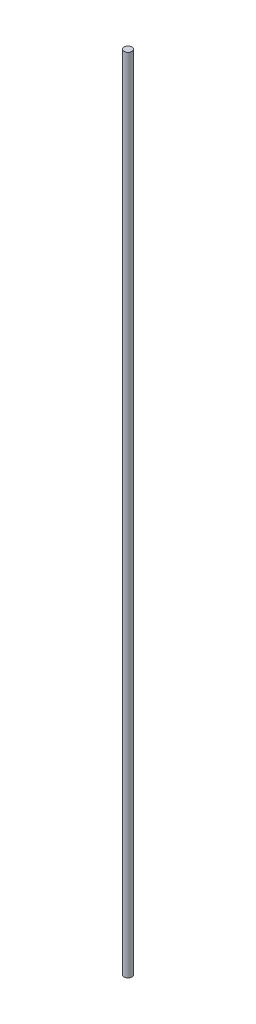
ISO-10303-21;
HEADER;
FILE_DESCRIPTION(('STEP AP214'),'2;1');
FILE_NAME('part.step','',(''),(''),'','','');
FILE_SCHEMA(('AUTOMOTIVE_DESIGN { 1 0 10303 214 1 1 1 1 }'));
ENDSEC;
DATA;
#1=APPLICATION_CONTEXT('core data for automotive mechanical design processes');
#2=APPLICATION_PROTOCOL_DEFINITION('international standard','automotive_design',2000,#1);
#3=PRODUCT_CONTEXT('',#1,'mechanical');
#4=PRODUCT('Part','Part','',(#3));
#5=PRODUCT_RELATED_PRODUCT_CATEGORY('part','',(#4));
#6=PRODUCT_DEFINITION_FORMATION('','',#4);
#7=PRODUCT_DEFINITION_CONTEXT('part definition',#1,'design');
#8=PRODUCT_DEFINITION('design','',#6,#7);
#9=PRODUCT_DEFINITION_SHAPE('','',#8);
#10=(LENGTH_UNIT() NAMED_UNIT(*) SI_UNIT(.MILLI.,.METRE.));
#11=(NAMED_UNIT(*) PLANE_ANGLE_UNIT() SI_UNIT($,.RADIAN.));
#12=(NAMED_UNIT(*) SI_UNIT($,.STERADIAN.) SOLID_ANGLE_UNIT());
#13=UNCERTAINTY_MEASURE_WITH_UNIT(LENGTH_MEASURE(1.E-05),#10,'distance_accuracy_value','');
#14=(GEOMETRIC_REPRESENTATION_CONTEXT(3) GLOBAL_UNCERTAINTY_ASSIGNED_CONTEXT((#13)) GLOBAL_UNIT_ASSIGNED_CONTEXT((#10,
#11,#12)) REPRESENTATION_CONTEXT('',''));
#15=CARTESIAN_POINT('',(0.,0.,0.));
#16=DIRECTION('',(0.,0.,1.));
#17=DIRECTION('',(1.,0.,0.));
#18=AXIS2_PLACEMENT_3D('',#15,#16,#17);
#19=CARTESIAN_POINT('',(0.,822.96,0.));
#20=DIRECTION('',(0.,-1.,0.));
#21=DIRECTION('',(0.,0.,-1.));
#22=AXIS2_PLACEMENT_3D('',#19,#20,#21);
#23=CYLINDRICAL_SURFACE('',#22,4.);
#24=CARTESIAN_POINT('',(0.,822.96,0.));
#25=DIRECTION('',(0.,1.,0.));
#26=DIRECTION('',(0.,0.,1.));
#27=AXIS2_PLACEMENT_3D('',#24,#25,#26);
#28=CIRCLE('',#27,4.);
#29=CARTESIAN_POINT('',(0.,822.96,4.));
#30=VERTEX_POINT('',#29);
#31=EDGE_CURVE('E10',#30,#30,#28,.T.);
#32=ORIENTED_EDGE('',*,*,#31,.F.);
#33=EDGE_LOOP('',(#32));
#34=FACE_BOUND('',#33,.T.);
#35=CARTESIAN_POINT('',(0.,0.,0.));
#36=DIRECTION('',(0.,1.,0.));
#37=DIRECTION('',(0.,0.,1.));
#38=AXIS2_PLACEMENT_3D('',#35,#36,#37);
#39=CIRCLE('',#38,4.);
#40=CARTESIAN_POINT('',(0.,0.,4.));
#41=VERTEX_POINT('',#40);
#42=EDGE_CURVE('E40',#41,#41,#39,.T.);
#43=ORIENTED_EDGE('',*,*,#42,.T.);
#44=EDGE_LOOP('',(#43));
#45=FACE_BOUND('',#44,.T.);
#46=ADVANCED_FACE('F37',(#34,#45),#23,.T.);
#47=CARTESIAN_POINT('',(0.,822.96,0.));
#48=DIRECTION('',(0.,1.,0.));
#49=DIRECTION('',(0.,0.,1.));
#50=AXIS2_PLACEMENT_3D('',#47,#48,#49);
#51=PLANE('',#50);
#52=ORIENTED_EDGE('',*,*,#31,.T.);
#53=EDGE_LOOP('',(#52));
#54=FACE_BOUND('',#53,.T.);
#55=ADVANCED_FACE('F54',(#54),#51,.T.);
#56=CARTESIAN_POINT('',(0.,0.,0.));
#57=DIRECTION('',(0.,1.,0.));
#58=DIRECTION('',(0.,0.,1.));
#59=AXIS2_PLACEMENT_3D('',#56,#57,#58);
#60=PLANE('',#59);
#61=ORIENTED_EDGE('',*,*,#42,.F.);
#62=EDGE_LOOP('',(#61));
#63=FACE_BOUND('',#62,.T.);
#64=ADVANCED_FACE('F52',(#63),#60,.F.);
#65=CLOSED_SHELL('',(#46,#55,#64));
#66=MANIFOLD_SOLID_BREP('B2',#65);
#67=ADVANCED_BREP_SHAPE_REPRESENTATION('',(#18,#66),#14);
#68=SHAPE_DEFINITION_REPRESENTATION(#9,#67);
ENDSEC;
END-ISO-10303-21;
